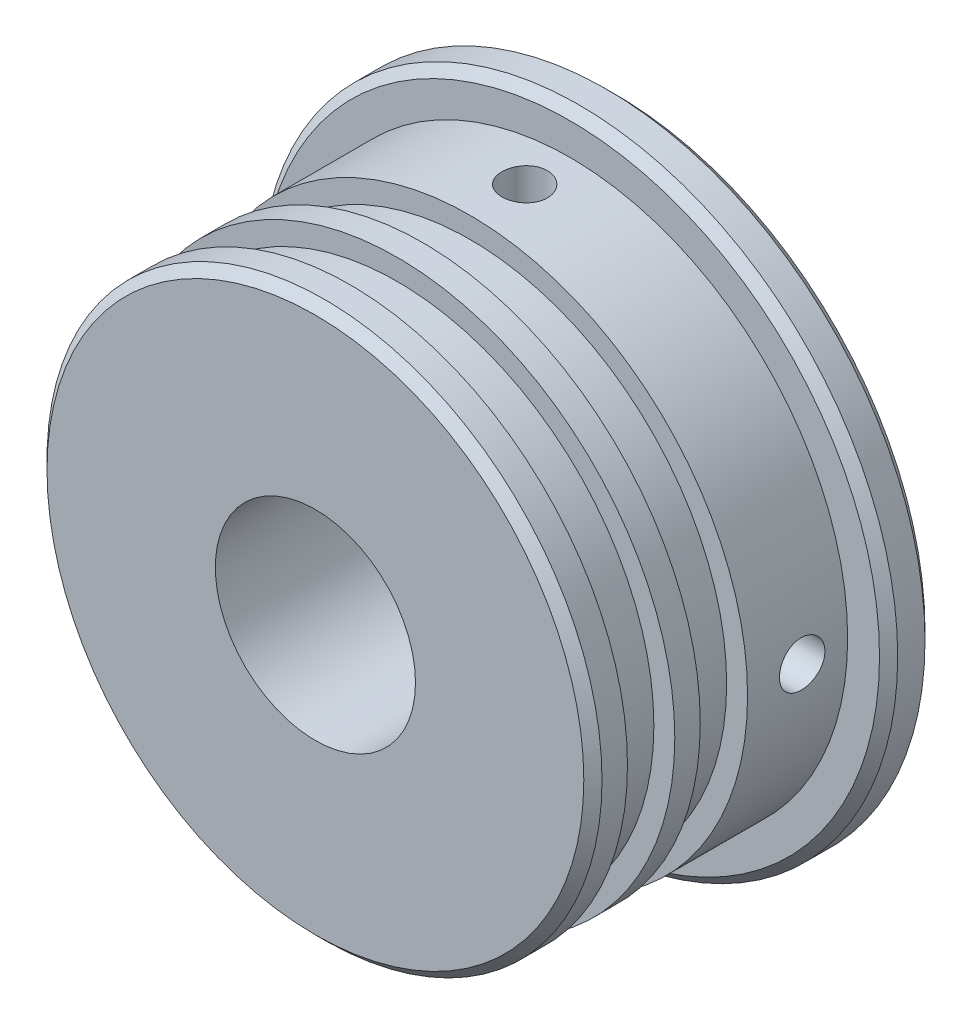
ISO-10303-21;
HEADER;
FILE_DESCRIPTION(('STEP AP214'),'2;1');
FILE_NAME('part.step','',(''),(''),'','','');
FILE_SCHEMA(('AUTOMOTIVE_DESIGN { 1 0 10303 214 1 1 1 1 }'));
ENDSEC;
DATA;
#1=APPLICATION_CONTEXT('core data for automotive mechanical design processes');
#2=APPLICATION_PROTOCOL_DEFINITION('international standard','automotive_design',2000,#1);
#3=PRODUCT_CONTEXT('',#1,'mechanical');
#4=PRODUCT('Part','Part','',(#3));
#5=PRODUCT_RELATED_PRODUCT_CATEGORY('part','',(#4));
#6=PRODUCT_DEFINITION_FORMATION('','',#4);
#7=PRODUCT_DEFINITION_CONTEXT('part definition',#1,'design');
#8=PRODUCT_DEFINITION('design','',#6,#7);
#9=PRODUCT_DEFINITION_SHAPE('','',#8);
#10=(LENGTH_UNIT() NAMED_UNIT(*) SI_UNIT(.MILLI.,.METRE.));
#11=(NAMED_UNIT(*) PLANE_ANGLE_UNIT() SI_UNIT($,.RADIAN.));
#12=(NAMED_UNIT(*) SI_UNIT($,.STERADIAN.) SOLID_ANGLE_UNIT());
#13=UNCERTAINTY_MEASURE_WITH_UNIT(LENGTH_MEASURE(1.E-05),#10,'distance_accuracy_value','');
#14=(GEOMETRIC_REPRESENTATION_CONTEXT(3) GLOBAL_UNCERTAINTY_ASSIGNED_CONTEXT((#13)) GLOBAL_UNIT_ASSIGNED_CONTEXT((#10,
#11,#12)) REPRESENTATION_CONTEXT('',''));
#15=CARTESIAN_POINT('',(0.,0.,0.));
#16=DIRECTION('',(0.,0.,1.));
#17=DIRECTION('',(1.,0.,0.));
#18=AXIS2_PLACEMENT_3D('',#15,#16,#17);
#19=CARTESIAN_POINT('',(0.,0.,14.));
#20=DIRECTION('',(0.,0.,-1.));
#21=DIRECTION('',(-1.,0.,0.));
#22=AXIS2_PLACEMENT_3D('',#19,#20,#21);
#23=CYLINDRICAL_SURFACE('',#22,15.25);
#24=CARTESIAN_POINT('',(0.,0.,0.));
#25=DIRECTION('',(0.,0.,1.));
#26=DIRECTION('',(1.,0.,0.));
#27=AXIS2_PLACEMENT_3D('',#24,#25,#26);
#28=CIRCLE('',#27,15.25);
#29=CARTESIAN_POINT('',(15.25,0.,0.));
#30=VERTEX_POINT('',#29);
#31=EDGE_CURVE('E191',#30,#30,#28,.T.);
#32=ORIENTED_EDGE('',*,*,#31,.T.);
#33=EDGE_LOOP('',(#32));
#34=FACE_BOUND('',#33,.T.);
#35=CARTESIAN_POINT('',(0.,0.,5.5));
#36=DIRECTION('',(0.,0.,1.));
#37=DIRECTION('',(1.,0.,0.));
#38=AXIS2_PLACEMENT_3D('',#35,#36,#37);
#39=CIRCLE('',#38,15.25);
#40=CARTESIAN_POINT('',(15.25,0.,5.5));
#41=VERTEX_POINT('',#40);
#42=EDGE_CURVE('E181',#41,#41,#39,.T.);
#43=ORIENTED_EDGE('',*,*,#42,.F.);
#44=EDGE_LOOP('',(#43));
#45=FACE_BOUND('',#44,.T.);
#46=CARTESIAN_POINT('',(0.,15.25,1.25));
#47=CARTESIAN_POINT('',(-0.0700868429087924,15.2499993280766,1.25000306301438));
#48=CARTESIAN_POINT('',(-0.140221499274186,15.2495116842103,1.25591442481886));
#49=CARTESIAN_POINT('',(-0.278550618483761,15.2476132613451,1.2794091397311));
#50=CARTESIAN_POINT('',(-0.346742787000886,15.2462014343999,1.29700574325258));
#51=CARTESIAN_POINT('',(-0.479163454668353,15.2426142015101,1.34335892818687));
#52=CARTESIAN_POINT('',(-0.543394161743101,15.2404392255128,1.37210922672617));
#53=CARTESIAN_POINT('',(-0.666102613849485,15.2355696593066,1.43994252213517));
#54=CARTESIAN_POINT('',(-0.72458159220008,15.2328751808608,1.47902329722773));
#55=CARTESIAN_POINT('',(-0.83428654311789,15.2272615583992,1.56651254117023));
#56=CARTESIAN_POINT('',(-0.885496350167448,15.2243419352614,1.61494125140961));
#57=CARTESIAN_POINT('',(-0.979070625550507,15.2186111080804,1.71970893756529));
#58=CARTESIAN_POINT('',(-1.02143470675745,15.2157999087865,1.77604825950319));
#59=CARTESIAN_POINT('',(-1.09616942084751,15.210599036483,1.89513543715002));
#60=CARTESIAN_POINT('',(-1.12852588903954,15.2082099629771,1.95789221052103));
#61=CARTESIAN_POINT('',(-1.18223640576973,15.2041292700176,2.08797068355829));
#62=CARTESIAN_POINT('',(-1.20359064296279,15.2024376386051,2.15529230492883));
#63=CARTESIAN_POINT('',(-1.23464375102437,15.1999473505619,2.29242781546401));
#64=CARTESIAN_POINT('',(-1.24436890544832,15.1991466805041,2.36223571579096));
#65=CARTESIAN_POINT('',(-1.25196897978082,15.198522591526,2.50249727871425));
#66=CARTESIAN_POINT('',(-1.2498441155197,15.1986991548068,2.57295092952587));
#67=CARTESIAN_POINT('',(-1.23382619797773,15.2000077548943,2.71232402919903));
#68=CARTESIAN_POINT('',(-1.21996170045579,15.2011374732007,2.781246784736));
#69=CARTESIAN_POINT('',(-1.18090243753149,15.2042214524571,2.91578362416247));
#70=CARTESIAN_POINT('',(-1.15570756462738,15.2061757212304,2.98139767665268));
#71=CARTESIAN_POINT('',(-1.09467073544124,15.2106912689216,3.10754562486508));
#72=CARTESIAN_POINT('',(-1.05881595691954,15.213253278104,3.16807328933147));
#73=CARTESIAN_POINT('',(-0.977486348890948,15.218694949435,3.28226216130019));
#74=CARTESIAN_POINT('',(-0.932011330983623,15.2215746178039,3.33592323429583));
#75=CARTESIAN_POINT('',(-0.83257190200739,15.2273374481536,3.43502172701963));
#76=CARTESIAN_POINT('',(-0.778582802157169,15.2302205953131,3.4804343775802));
#77=CARTESIAN_POINT('',(-0.663733925208983,15.2356574071383,3.56155545049435));
#78=CARTESIAN_POINT('',(-0.602874143714134,15.2382110715931,3.59726386663766));
#79=CARTESIAN_POINT('',(-0.475995469446632,15.2427016502544,3.65796125689699));
#80=CARTESIAN_POINT('',(-0.40997605517001,15.2446385020167,3.68294914578724));
#81=CARTESIAN_POINT('',(-0.274659503256255,15.247676499519,3.72147888435788));
#82=CARTESIAN_POINT('',(-0.205362431459666,15.2487776620386,3.73502096385503));
#83=CARTESIAN_POINT('',(-0.0656723647526651,15.2500180549452,3.75024364586132));
#84=CARTESIAN_POINT('',(0.00471687800008904,15.2501600600542,3.75195846345862));
#85=CARTESIAN_POINT('',(0.14478186253043,15.2494735463779,3.7435675585618));
#86=CARTESIAN_POINT('',(0.214457610738095,15.2486450363468,3.73346194268926));
#87=CARTESIAN_POINT('',(0.351020295392792,15.2461124596337,3.70174538863647));
#88=CARTESIAN_POINT('',(0.41791093659395,15.2444095990401,3.68015029767846));
#89=CARTESIAN_POINT('',(0.547119356040493,15.2403196360293,3.62608397799776));
#90=CARTESIAN_POINT('',(0.609437064248042,15.2379325231352,3.59361258273883));
#91=CARTESIAN_POINT('',(0.727886425550712,15.2327347804462,3.51862933263179));
#92=CARTESIAN_POINT('',(0.784003678514773,15.2299231992295,3.47609479718825));
#93=CARTESIAN_POINT('',(0.888313835484227,15.2241956377279,3.38222544765046));
#94=CARTESIAN_POINT('',(0.936506606260644,15.2212796556887,3.3308904856302));
#95=CARTESIAN_POINT('',(1.02371703784269,15.2156637405143,3.22072908525297));
#96=CARTESIAN_POINT('',(1.06271238083786,15.2129643431806,3.16188494767183));
#97=CARTESIAN_POINT('',(1.13026802407668,15.2080947598364,3.03846372819848));
#98=CARTESIAN_POINT('',(1.15882842559743,15.2059245686898,2.97388670195479));
#99=CARTESIAN_POINT('',(1.20466539747239,15.2023620805104,2.8409120191016));
#100=CARTESIAN_POINT('',(1.22195565828569,15.2009688399715,2.77251910796312));
#101=CARTESIAN_POINT('',(1.24480612564966,15.1991148163268,2.633789027968));
#102=CARTESIAN_POINT('',(1.25036654931429,15.198654015962,2.56345189512241));
#103=CARTESIAN_POINT('',(1.24959702875324,15.1987172866662,2.42305178436102));
#104=CARTESIAN_POINT('',(1.24330215197592,15.1992384531232,2.35298861026405));
#105=CARTESIAN_POINT('',(1.21907381047037,15.201200764538,2.21491809012702));
#106=CARTESIAN_POINT('',(1.20114032769815,15.2026419109221,2.14691074727439));
#107=CARTESIAN_POINT('',(1.15415265709678,15.2062810387023,2.01487987806237));
#108=CARTESIAN_POINT('',(1.12509906889614,15.2084789792893,1.95085613711191));
#109=CARTESIAN_POINT('',(1.05669988676471,15.2133841018093,1.82858935076014));
#110=CARTESIAN_POINT('',(1.01735446212428,15.2160912753659,1.77034621029551));
#111=CARTESIAN_POINT('',(0.929356780527805,15.2217193443612,1.66111454001474));
#112=CARTESIAN_POINT('',(0.880678585944513,15.2246408210819,1.61014693575611));
#113=CARTESIAN_POINT('',(0.775443669354106,15.2303630218454,1.5170853062341));
#114=CARTESIAN_POINT('',(0.718885042337266,15.2331637164755,1.47499343278552));
#115=CARTESIAN_POINT('',(0.599389140420523,15.2383336734095,1.40082361781703));
#116=CARTESIAN_POINT('',(0.536440480834047,15.2407021438841,1.3687639799632));
#117=CARTESIAN_POINT('',(0.406077398152225,15.244731428387,1.31571014744989));
#118=CARTESIAN_POINT('',(0.338668216820175,15.2463930565732,1.29470321537387));
#119=CARTESIAN_POINT('',(0.225716881578611,15.2483942112371,1.26970931549527));
#120=CARTESIAN_POINT('',(0.180901423889862,15.2489936455353,1.26232812603322));
#121=CARTESIAN_POINT('',(0.0907306568461201,15.2497967569183,1.25247248302948));
#122=CARTESIAN_POINT('',(0.0453753488702889,15.250000435014,1.24999801695524));
#123=CARTESIAN_POINT('',(0.,15.25,1.25));
#124=B_SPLINE_CURVE_WITH_KNOTS('',3,(#46,#47,#48,#49,#50,#51,#52,#53,#54,#55,#56,#57,#58,#59,
#60,#61,#62,#63,#64,#65,#66,#67,#68,#69,#70,#71,#72,#73,#74,#75,#76,#77,#78,#79,#80,#81,#82,#83,
#84,#85,#86,#87,#88,#89,#90,#91,#92,#93,#94,#95,#96,#97,#98,#99,#100,#101,#102,#103,#104,#105,
#106,#107,#108,#109,#110,#111,#112,#113,#114,#115,#116,#117,#118,#119,#120,#121,#122,#123),
.UNSPECIFIED.,.T.,.F.,(4,2,2,2,2,2,2,2,2,2,2,2,2,2,2,2,2,2,2,2,2,2,2,2,2,2,2,2,2,2,2,2,2,2,2,2,
2,2,4),(0.,0.210094860791217,0.42042836520023,0.6306435604321,0.840813581383413,
1.05144390166047,1.2620834380843,1.47301976181957,1.68395246851599,1.89440752754976,
2.10485875347288,2.31479953859993,2.52474231567163,2.73493865064623,2.94513910243604,
3.15596068923547,3.36678241095067,3.57762546885637,3.788464293211,3.9986929251026,
4.20891966072406,4.41885718332474,4.6287979206024,4.83921641332595,5.04963844331211,
5.26056593258537,5.47149137463205,5.68216011407615,5.89282495410355,6.10286763547763,
6.31291064249356,6.52294232497331,6.73297055286048,6.9435911817377,7.15426281450869,
7.36531660326365,7.57612663261143,7.71214577055269,7.84816456107893),.UNSPECIFIED.);
#125=CARTESIAN_POINT('',(0.,15.25,1.25));
#126=VERTEX_POINT('',#125);
#127=EDGE_CURVE('E71',#126,#126,#124,.T.);
#128=ORIENTED_EDGE('',*,*,#127,.F.);
#129=EDGE_LOOP('',(#128));
#130=FACE_BOUND('',#129,.T.);
#131=CARTESIAN_POINT('',(15.1986841535707,-1.24999999999984,2.5));
#132=CARTESIAN_POINT('',(15.1986848339446,-1.24999693658352,2.42991360305348));
#133=CARTESIAN_POINT('',(15.199174161196,-1.24408564746329,2.35977939119693));
#134=CARTESIAN_POINT('',(15.2010785982593,-1.22059124751342,2.22145119558452));
#135=CARTESIAN_POINT('',(15.2024947591589,-1.2029948847416,2.15325950650436));
#136=CARTESIAN_POINT('',(15.2060913945655,-1.15664240411943,2.02083985247226));
#137=CARTESIAN_POINT('',(15.2082714379165,-1.12789258060607,1.95660967553571));
#138=CARTESIAN_POINT('',(15.2131496620471,-1.06006040374254,1.83390211116577));
#139=CARTESIAN_POINT('',(15.2158477314376,-1.02098027099786,1.77542349107885));
#140=CARTESIAN_POINT('',(15.2214655434985,-0.933491674996942,1.6657181334001));
#141=CARTESIAN_POINT('',(15.2243857619743,-0.885062826932664,1.61450767533015));
#142=CARTESIAN_POINT('',(15.2301144747859,-0.780294592080531,1.52093214410294));
#143=CARTESIAN_POINT('',(15.2329229642528,-0.723954861044009,1.47856745607637));
#144=CARTESIAN_POINT('',(15.2381162629198,-0.604867327155328,1.40383210916556));
#145=CARTESIAN_POINT('',(15.2405004743981,-0.542110676973627,1.3714755030423));
#146=CARTESIAN_POINT('',(15.2445714601224,-0.412032471746592,1.31776469729084));
#147=CARTESIAN_POINT('',(15.2462582462226,-0.344710994311932,1.2964103106572));
#148=CARTESIAN_POINT('',(15.2487410029099,-0.207575915492183,1.26535688775954));
#149=CARTESIAN_POINT('',(15.2495389829939,-0.137768305578273,1.25563155574531));
#150=CARTESIAN_POINT('',(15.250161023854,0.00249268938558378,1.24803102562128));
#151=CARTESIAN_POINT('',(15.249985102212,0.0729460627545569,1.2501556135834));
#152=CARTESIAN_POINT('',(15.2486808206319,0.212320386098874,1.26617309559805));
#153=CARTESIAN_POINT('',(15.2475547493001,0.281244610259826,1.28003771196652));
#154=CARTESIAN_POINT('',(15.2444794672483,0.415784325641072,1.31909772239888));
#155=CARTESIAN_POINT('',(15.2425302489126,0.481399786242991,1.34429322129421));
#156=CARTESIAN_POINT('',(15.2380240375926,0.607549433922569,1.40533134267823));
#157=CARTESIAN_POINT('',(15.2354663217737,0.668077461017877,1.44118664069611));
#158=CARTESIAN_POINT('',(15.2300305791155,0.782266837544206,1.52251735536991));
#159=CARTESIAN_POINT('',(15.2271525459942,0.835928052258726,1.56799296071533));
#160=CARTESIAN_POINT('',(15.2213896563097,0.935025874267423,1.66743280398354));
#161=CARTESIAN_POINT('',(15.2185048045695,0.980437831210621,1.72142161136147));
#162=CARTESIAN_POINT('',(15.2130619392315,1.06155764436563,1.83626965687285));
#163=CARTESIAN_POINT('',(15.2105039258905,1.09726549295039,1.89712890040615));
#164=CARTESIAN_POINT('',(15.2060038751374,1.15796247582315,2.02400743401802));
#165=CARTESIAN_POINT('',(15.2040619102206,1.18295034872664,2.09002733025384));
#166=CARTESIAN_POINT('',(15.2010152176372,1.22147990740891,2.2253449290061));
#167=CARTESIAN_POINT('',(15.1999104729489,1.23502182589802,2.29464256485182));
#168=CARTESIAN_POINT('',(15.1986660440273,1.25024390136809,2.43433288586504));
#169=CARTESIAN_POINT('',(15.1985235637509,1.25195842541547,2.50472180219505));
#170=CARTESIAN_POINT('',(15.1992124146146,1.24356704994933,2.64478606317713));
#171=CARTESIAN_POINT('',(15.2000437369714,1.23346125705034,2.71446141425955));
#172=CARTESIAN_POINT('',(15.2025839730989,1.20174475707424,2.85102216448946));
#173=CARTESIAN_POINT('',(15.2042916645498,1.18015007264501,2.91791130959227));
#174=CARTESIAN_POINT('',(15.2083912076355,1.12608506759044,3.04711691691239));
#175=CARTESIAN_POINT('',(15.2107830698969,1.09361457804043,3.10943330808664));
#176=CARTESIAN_POINT('',(15.2159882279838,1.01863265402226,3.22788178439302));
#177=CARTESIAN_POINT('',(15.2188024799744,0.97609830870094,3.28399932352413));
#178=CARTESIAN_POINT('',(15.2245320773169,0.882229174899993,3.38831014655002));
#179=CARTESIAN_POINT('',(15.2274474243518,0.830894239866416,3.43650329845584));
#180=CARTESIAN_POINT('',(15.2330590376291,0.72073267055032,3.52371453600203));
#181=CARTESIAN_POINT('',(15.23575476067,0.66188833275854,3.56271029906659));
#182=CARTESIAN_POINT('',(15.2406155617798,0.538466602526535,3.63026667968633));
#183=CARTESIAN_POINT('',(15.2427806450028,0.473889265780309,3.65882739860038));
#184=CARTESIAN_POINT('',(15.2463337134228,0.340914793228101,3.70466458427029));
#185=CARTESIAN_POINT('',(15.2477226505895,0.272522450456076,3.72195487894049));
#186=CARTESIAN_POINT('',(15.2495707915124,0.133793567732087,3.74480560667045));
#187=CARTESIAN_POINT('',(15.2500300122377,0.0634570632886172,3.75036625381922));
#188=CARTESIAN_POINT('',(15.2499670067415,-0.0769434451044363,3.7495973777545));
#189=CARTESIAN_POINT('',(15.2494476529438,-0.147007643544878,3.74330265380566));
#190=CARTESIAN_POINT('',(15.2474915385945,-0.285080250094358,3.71907425726429));
#191=CARTESIAN_POINT('',(15.2460547767643,-0.353088655337742,3.70114056844852));
#192=CARTESIAN_POINT('',(15.2424250725383,-0.485121627507812,3.6541520931392));
#193=CARTESIAN_POINT('',(15.2402321705169,-0.549146406926175,3.62509790041974));
#194=CARTESIAN_POINT('',(15.2353355815636,-0.671415017419427,3.55669718835404));
#195=CARTESIAN_POINT('',(15.2326319030899,-0.729658944199258,3.51735083943888));
#196=CARTESIAN_POINT('',(15.2270078279113,-0.838890548849217,3.42935214954373));
#197=CARTESIAN_POINT('',(15.2240868460688,-0.889857470519754,3.3806740817463));
#198=CARTESIAN_POINT('',(15.2183623467353,-0.982917782161334,3.27543969842741));
#199=CARTESIAN_POINT('',(15.2155588578845,-1.02500901854132,3.21888147638586));
#200=CARTESIAN_POINT('',(15.2103812075108,-1.09917815738628,3.09938589608275));
#201=CARTESIAN_POINT('',(15.2080078391107,-1.13123763923894,3.03643708057574));
#202=CARTESIAN_POINT('',(15.2039688561467,-1.1842911367374,2.90607366549575));
#203=CARTESIAN_POINT('',(15.202302427177,-1.20529789204799,2.83866430864196));
#204=CARTESIAN_POINT('',(15.2002951847963,-1.23029128755323,2.72571344742056));
#205=CARTESIAN_POINT('',(15.1996938195012,-1.23767225011609,2.68089867495409));
#206=CARTESIAN_POINT('',(15.1988880841608,-1.2475275916435,2.59072928111191));
#207=CARTESIAN_POINT('',(15.1986837130896,-1.25000198328738,2.54537466113155));
#208=CARTESIAN_POINT('',(15.1986841535707,-1.24999999999984,2.5));
#209=B_SPLINE_CURVE_WITH_KNOTS('',3,(#131,#132,#133,#134,#135,#136,#137,#138,#139,#140,#141,
#142,#143,#144,#145,#146,#147,#148,#149,#150,#151,#152,#153,#154,#155,#156,#157,#158,#159,#160,
#161,#162,#163,#164,#165,#166,#167,#168,#169,#170,#171,#172,#173,#174,#175,#176,#177,#178,#179,
#180,#181,#182,#183,#184,#185,#186,#187,#188,#189,#190,#191,#192,#193,#194,#195,#196,#197,#198,
#199,#200,#201,#202,#203,#204,#205,#206,#207,#208),.UNSPECIFIED.,.T.,.F.,(4,2,2,2,2,2,2,2,2,2,2,
2,2,2,2,2,2,2,2,2,2,2,2,2,2,2,2,2,2,2,2,2,2,2,2,2,2,2,4),(0.,0.210093521323371,
0.420425715756466,0.630639383716231,0.840807900796242,1.05143997368959,1.26208121525537,
1.47301689808563,1.68394899551014,1.89440322343688,2.10485365201923,2.31479861521414,
2.52474552082472,2.7349430789113,2.94514476012483,3.1559645863687,3.36678457830843,
3.57762936994871,3.78846987475219,3.99869747759378,4.20892318428145,4.41885647140858,
4.62879301940303,4.8392121762978,5.04963483758905,5.26056306858212,5.4714892507083,
5.68215615362665,5.89281921142862,6.10286487007458,6.31291082149818,6.52294555918085,
6.73297681905195,6.94359566979172,7.15426556631035,7.36532006153524,7.57613075388127,
7.71214783260012,7.84816455982974),.UNSPECIFIED.);
#210=CARTESIAN_POINT('',(15.1986841535707,-1.24999999999984,2.5));
#211=VERTEX_POINT('',#210);
#212=EDGE_CURVE('E80',#211,#211,#209,.T.);
#213=ORIENTED_EDGE('',*,*,#212,.F.);
#214=EDGE_LOOP('',(#213));
#215=FACE_BOUND('',#214,.T.);
#216=CARTESIAN_POINT('',(0.,-15.25,3.75));
#217=CARTESIAN_POINT('',(-0.0700868429087924,-15.2499993280766,3.74999693698562));
#218=CARTESIAN_POINT('',(-0.140221499274186,-15.2495116842103,3.74408557518114));
#219=CARTESIAN_POINT('',(-0.278550618483761,-15.2476132613451,3.7205908602689));
#220=CARTESIAN_POINT('',(-0.346742787000885,-15.2462014343999,3.70299425674742));
#221=CARTESIAN_POINT('',(-0.479163454668353,-15.2426142015101,3.65664107181313));
#222=CARTESIAN_POINT('',(-0.543394161743102,-15.2404392255128,3.62789077327383));
#223=CARTESIAN_POINT('',(-0.666102613849485,-15.2355696593066,3.56005747786483));
#224=CARTESIAN_POINT('',(-0.724581592200081,-15.2328751808608,3.52097670277227));
#225=CARTESIAN_POINT('',(-0.83428654311789,-15.2272615583992,3.43348745882977));
#226=CARTESIAN_POINT('',(-0.885496350167448,-15.2243419352614,3.38505874859039));
#227=CARTESIAN_POINT('',(-0.979070625550507,-15.2186111080804,3.28029106243471));
#228=CARTESIAN_POINT('',(-1.02143470675745,-15.2157999087865,3.22395174049681));
#229=CARTESIAN_POINT('',(-1.09616942084751,-15.210599036483,3.10486456284998));
#230=CARTESIAN_POINT('',(-1.12852588903954,-15.2082099629771,3.04210778947897));
#231=CARTESIAN_POINT('',(-1.18223640576973,-15.2041292700176,2.91202931644171));
#232=CARTESIAN_POINT('',(-1.20359064296279,-15.2024376386051,2.84470769507117));
#233=CARTESIAN_POINT('',(-1.23464375102437,-15.1999473505619,2.70757218453599));
#234=CARTESIAN_POINT('',(-1.24436890544832,-15.1991466805041,2.63776428420904));
#235=CARTESIAN_POINT('',(-1.25196897978082,-15.198522591526,2.49750272128575));
#236=CARTESIAN_POINT('',(-1.2498441155197,-15.1986991548068,2.42704907047413));
#237=CARTESIAN_POINT('',(-1.23382619797773,-15.2000077548943,2.28767597080097));
#238=CARTESIAN_POINT('',(-1.21996170045579,-15.2011374732007,2.218753215264));
#239=CARTESIAN_POINT('',(-1.18090243753149,-15.2042214524571,2.08421637583753));
#240=CARTESIAN_POINT('',(-1.15570756462738,-15.2061757212304,2.01860232334732));
#241=CARTESIAN_POINT('',(-1.09467073544124,-15.2106912689216,1.89245437513492));
#242=CARTESIAN_POINT('',(-1.05881595691954,-15.213253278104,1.83192671066853));
#243=CARTESIAN_POINT('',(-0.977486348890948,-15.218694949435,1.71773783869981));
#244=CARTESIAN_POINT('',(-0.932011330983623,-15.2215746178039,1.66407676570417));
#245=CARTESIAN_POINT('',(-0.83257190200739,-15.2273374481536,1.56497827298037));
#246=CARTESIAN_POINT('',(-0.77858280215717,-15.2302205953131,1.5195656224198));
#247=CARTESIAN_POINT('',(-0.663733925208984,-15.2356574071383,1.43844454950565));
#248=CARTESIAN_POINT('',(-0.602874143714134,-15.2382110715931,1.40273613336234));
#249=CARTESIAN_POINT('',(-0.475995469446633,-15.2427016502544,1.34203874310301));
#250=CARTESIAN_POINT('',(-0.40997605517001,-15.2446385020167,1.31705085421276));
#251=CARTESIAN_POINT('',(-0.274659503256256,-15.247676499519,1.27852111564212));
#252=CARTESIAN_POINT('',(-0.205362431459666,-15.2487776620386,1.26497903614497));
#253=CARTESIAN_POINT('',(-0.0656723647526657,-15.2500180549452,1.24975635413868));
#254=CARTESIAN_POINT('',(0.00471687800008803,-15.2501600600542,1.24804153654138));
#255=CARTESIAN_POINT('',(0.144781862530429,-15.2494735463779,1.2564324414382));
#256=CARTESIAN_POINT('',(0.214457610738094,-15.2486450363468,1.26653805731074));
#257=CARTESIAN_POINT('',(0.351020295392792,-15.2461124596337,1.29825461136353));
#258=CARTESIAN_POINT('',(0.417910936593949,-15.2444095990401,1.31984970232154));
#259=CARTESIAN_POINT('',(0.547119356040493,-15.2403196360293,1.37391602200224));
#260=CARTESIAN_POINT('',(0.609437064248042,-15.2379325231352,1.40638741726117));
#261=CARTESIAN_POINT('',(0.727886425550711,-15.2327347804462,1.48137066736821));
#262=CARTESIAN_POINT('',(0.784003678514773,-15.2299231992295,1.52390520281175));
#263=CARTESIAN_POINT('',(0.888313835484227,-15.2241956377279,1.61777455234954));
#264=CARTESIAN_POINT('',(0.936506606260644,-15.2212796556887,1.6691095143698));
#265=CARTESIAN_POINT('',(1.02371703784269,-15.2156637405143,1.77927091474702));
#266=CARTESIAN_POINT('',(1.06271238083786,-15.2129643431806,1.83811505232816));
#267=CARTESIAN_POINT('',(1.13026802407668,-15.2080947598364,1.96153627180152));
#268=CARTESIAN_POINT('',(1.15882842559743,-15.2059245686898,2.02611329804521));
#269=CARTESIAN_POINT('',(1.20466539747239,-15.2023620805104,2.1590879808984));
#270=CARTESIAN_POINT('',(1.22195565828569,-15.2009688399715,2.22748089203688));
#271=CARTESIAN_POINT('',(1.24480612564966,-15.1991148163268,2.366210972032));
#272=CARTESIAN_POINT('',(1.25036654931429,-15.198654015962,2.43654810487759));
#273=CARTESIAN_POINT('',(1.24959702875324,-15.1987172866662,2.57694821563898));
#274=CARTESIAN_POINT('',(1.24330215197592,-15.1992384531232,2.64701138973595));
#275=CARTESIAN_POINT('',(1.21907381047037,-15.201200764538,2.78508190987298));
#276=CARTESIAN_POINT('',(1.20114032769815,-15.2026419109221,2.8530892527256));
#277=CARTESIAN_POINT('',(1.15415265709678,-15.2062810387023,2.98512012193763));
#278=CARTESIAN_POINT('',(1.12509906889614,-15.2084789792893,3.04914386288809));
#279=CARTESIAN_POINT('',(1.05669988676471,-15.2133841018093,3.17141064923986));
#280=CARTESIAN_POINT('',(1.01735446212428,-15.2160912753659,3.22965378970449));
#281=CARTESIAN_POINT('',(0.929356780527805,-15.2217193443612,3.33888545998526));
#282=CARTESIAN_POINT('',(0.880678585944513,-15.2246408210819,3.38985306424389));
#283=CARTESIAN_POINT('',(0.775443669354107,-15.2303630218454,3.4829146937659));
#284=CARTESIAN_POINT('',(0.718885042337267,-15.2331637164755,3.52500656721448));
#285=CARTESIAN_POINT('',(0.599389140420524,-15.2383336734095,3.59917638218297));
#286=CARTESIAN_POINT('',(0.536440480834047,-15.2407021438841,3.6312360200368));
#287=CARTESIAN_POINT('',(0.406077398152225,-15.244731428387,3.68428985255011));
#288=CARTESIAN_POINT('',(0.338668216820175,-15.2463930565732,3.70529678462613));
#289=CARTESIAN_POINT('',(0.225716881578611,-15.2483942112371,3.73029068450473));
#290=CARTESIAN_POINT('',(0.180901423889862,-15.2489936455353,3.73767187396678));
#291=CARTESIAN_POINT('',(0.0907306568461201,-15.2497967569183,3.74752751697052));
#292=CARTESIAN_POINT('',(0.0453753488702889,-15.250000435014,3.75000198304476));
#293=CARTESIAN_POINT('',(0.,-15.25,3.75));
#294=B_SPLINE_CURVE_WITH_KNOTS('',3,(#216,#217,#218,#219,#220,#221,#222,#223,#224,#225,#226,
#227,#228,#229,#230,#231,#232,#233,#234,#235,#236,#237,#238,#239,#240,#241,#242,#243,#244,#245,
#246,#247,#248,#249,#250,#251,#252,#253,#254,#255,#256,#257,#258,#259,#260,#261,#262,#263,#264,
#265,#266,#267,#268,#269,#270,#271,#272,#273,#274,#275,#276,#277,#278,#279,#280,#281,#282,#283,
#284,#285,#286,#287,#288,#289,#290,#291,#292,#293),.UNSPECIFIED.,.T.,.F.,(4,2,2,2,2,2,2,2,2,2,2,
2,2,2,2,2,2,2,2,2,2,2,2,2,2,2,2,2,2,2,2,2,2,2,2,2,2,2,4),(0.,0.210094860791217,0.42042836520023,
0.630643560432101,0.840813581383413,1.05144390166047,1.2620834380843,1.47301976181957,
1.68395246851599,1.89440752754976,2.10485875347288,2.31479953859994,2.52474231567163,
2.73493865064623,2.94513910243604,3.15596068923547,3.36678241095067,3.57762546885637,
3.788464293211,3.9986929251026,4.20891966072406,4.41885718332474,4.6287979206024,
4.83921641332595,5.04963844331211,5.26056593258537,5.47149137463205,5.68216011407615,
5.89282495410355,6.10286763547763,6.31291064249356,6.52294232497331,6.73297055286048,
6.9435911817377,7.15426281450869,7.36531660326365,7.57612663261144,7.71214577055269,
7.84816456107893),.UNSPECIFIED.);
#295=CARTESIAN_POINT('',(0.,-15.25,3.75));
#296=VERTEX_POINT('',#295);
#297=EDGE_CURVE('E250',#296,#296,#294,.T.);
#298=ORIENTED_EDGE('',*,*,#297,.F.);
#299=EDGE_LOOP('',(#298));
#300=FACE_BOUND('',#299,.T.);
#301=CARTESIAN_POINT('',(-15.25,0.,3.75));
#302=CARTESIAN_POINT('',(-15.2499993280766,0.0700868429087924,3.74999693698561));
#303=CARTESIAN_POINT('',(-15.2495116842103,0.140221499274186,3.74408557518113));
#304=CARTESIAN_POINT('',(-15.2476132613451,0.278550618483759,3.72059086026889));
#305=CARTESIAN_POINT('',(-15.2462014343999,0.346742787000883,3.7029942567474));
#306=CARTESIAN_POINT('',(-15.2426142015101,0.479163454668349,3.65664107181311));
#307=CARTESIAN_POINT('',(-15.2404392255128,0.543394161743096,3.62789077327381));
#308=CARTESIAN_POINT('',(-15.2355696593066,0.666102613849477,3.56005747786481));
#309=CARTESIAN_POINT('',(-15.2328751808608,0.724581592200071,3.52097670277224));
#310=CARTESIAN_POINT('',(-15.2272615583992,0.834286543117876,3.43348745882974));
#311=CARTESIAN_POINT('',(-15.2243419352614,0.885496350167433,3.38505874859035));
#312=CARTESIAN_POINT('',(-15.2186111080804,0.979070625550488,3.28029106243467));
#313=CARTESIAN_POINT('',(-15.2157999087865,1.02143470675743,3.22395174049677));
#314=CARTESIAN_POINT('',(-15.210599036483,1.09616942084748,3.10486456284994));
#315=CARTESIAN_POINT('',(-15.2082099629771,1.12852588903951,3.04210778947892));
#316=CARTESIAN_POINT('',(-15.2041292700176,1.18223640576969,2.91202931644166));
#317=CARTESIAN_POINT('',(-15.2024376386051,1.20359064296275,2.84470769507112));
#318=CARTESIAN_POINT('',(-15.1999473505619,1.23464375102432,2.70757218453594));
#319=CARTESIAN_POINT('',(-15.1991466805041,1.24436890544827,2.63776428420899));
#320=CARTESIAN_POINT('',(-15.198522591526,1.25196897978077,2.4975027212857));
#321=CARTESIAN_POINT('',(-15.1986991548068,1.24984411551964,2.42704907047408));
#322=CARTESIAN_POINT('',(-15.2000077548944,1.23382619797767,2.28767597080092));
#323=CARTESIAN_POINT('',(-15.2011374732007,1.21996170045572,2.21875321526395));
#324=CARTESIAN_POINT('',(-15.2042214524571,1.18090243753142,2.08421637583748));
#325=CARTESIAN_POINT('',(-15.2061757212304,1.15570756462731,2.01860232334728));
#326=CARTESIAN_POINT('',(-15.2106912689216,1.09467073544117,1.89245437513488));
#327=CARTESIAN_POINT('',(-15.213253278104,1.05881595691946,1.83192671066849));
#328=CARTESIAN_POINT('',(-15.218694949435,0.977486348890862,1.71773783869976));
#329=CARTESIAN_POINT('',(-15.2215746178039,0.932011330983534,1.66407676570413));
#330=CARTESIAN_POINT('',(-15.2273374481536,0.832571902007297,1.56497827298034));
#331=CARTESIAN_POINT('',(-15.2302205953131,0.778582802157075,1.51956562241977));
#332=CARTESIAN_POINT('',(-15.2356574071383,0.663733925208885,1.43844454950562));
#333=CARTESIAN_POINT('',(-15.2382110715931,0.602874143714034,1.40273613336231));
#334=CARTESIAN_POINT('',(-15.2427016502544,0.47599546944653,1.34203874310299));
#335=CARTESIAN_POINT('',(-15.2446385020167,0.409976055169906,1.31705085421275));
#336=CARTESIAN_POINT('',(-15.247676499519,0.27465950325615,1.27852111564211));
#337=CARTESIAN_POINT('',(-15.2487776620386,0.20536243145956,1.26497903614496));
#338=CARTESIAN_POINT('',(-15.2500180549452,0.0656723647525592,1.24975635413868));
#339=CARTESIAN_POINT('',(-15.2501600600542,-0.00471687800019477,1.24804153654138));
#340=CARTESIAN_POINT('',(-15.2494735463779,-0.144781862530535,1.2564324414382));
#341=CARTESIAN_POINT('',(-15.2486450363468,-0.2144576107382,1.26653805731075));
#342=CARTESIAN_POINT('',(-15.2461124596337,-0.351020295392896,1.29825461136355));
#343=CARTESIAN_POINT('',(-15.2444095990401,-0.417910936594053,1.31984970232156));
#344=CARTESIAN_POINT('',(-15.2403196360293,-0.547119356040594,1.37391602200226));
#345=CARTESIAN_POINT('',(-15.2379325231352,-0.609437064248142,1.4063874172612));
#346=CARTESIAN_POINT('',(-15.2327347804462,-0.727886425550808,1.48137066736824));
#347=CARTESIAN_POINT('',(-15.2299231992295,-0.784003678514868,1.52390520281178));
#348=CARTESIAN_POINT('',(-15.2241956377279,-0.888313835484318,1.61777455234958));
#349=CARTESIAN_POINT('',(-15.2212796556887,-0.936506606260733,1.66910951436984));
#350=CARTESIAN_POINT('',(-15.2156637405143,-1.02371703784278,1.77927091474707));
#351=CARTESIAN_POINT('',(-15.2129643431806,-1.06271238083794,1.83811505232821));
#352=CARTESIAN_POINT('',(-15.2080947598364,-1.13026802407676,1.96153627180157));
#353=CARTESIAN_POINT('',(-15.2059245686898,-1.1588284255975,2.02611329804526));
#354=CARTESIAN_POINT('',(-15.2023620805104,-1.20466539747246,2.15908798089846));
#355=CARTESIAN_POINT('',(-15.2009688399715,-1.22195565828575,2.22748089203693));
#356=CARTESIAN_POINT('',(-15.1991148163268,-1.24480612564972,2.36621097203206));
#357=CARTESIAN_POINT('',(-15.198654015962,-1.25036654931434,2.43654810487764));
#358=CARTESIAN_POINT('',(-15.1987172866662,-1.24959702875329,2.57694821563903));
#359=CARTESIAN_POINT('',(-15.1992384531232,-1.24330215197597,2.647011389736));
#360=CARTESIAN_POINT('',(-15.201200764538,-1.21907381047041,2.78508190987303));
#361=CARTESIAN_POINT('',(-15.2026419109221,-1.20114032769819,2.85308925272566));
#362=CARTESIAN_POINT('',(-15.2062810387023,-1.15415265709681,2.98512012193768));
#363=CARTESIAN_POINT('',(-15.2084789792893,-1.12509906889617,3.04914386288814));
#364=CARTESIAN_POINT('',(-15.2133841018093,-1.05669988676474,3.1714106492399));
#365=CARTESIAN_POINT('',(-15.2160912753659,-1.0173544621243,3.22965378970453));
#366=CARTESIAN_POINT('',(-15.2217193443612,-0.929356780527823,3.3388854599853));
#367=CARTESIAN_POINT('',(-15.2246408210819,-0.880678585944528,3.38985306424393));
#368=CARTESIAN_POINT('',(-15.2303630218454,-0.775443669354117,3.48291469376593));
#369=CARTESIAN_POINT('',(-15.2331637164755,-0.718885042337276,3.52500656721451));
#370=CARTESIAN_POINT('',(-15.2383336734095,-0.59938914042053,3.599176382183));
#371=CARTESIAN_POINT('',(-15.2407021438841,-0.536440480834052,3.63123602003683));
#372=CARTESIAN_POINT('',(-15.244731428387,-0.406077398152228,3.68428985255013));
#373=CARTESIAN_POINT('',(-15.2463930565732,-0.338668216820176,3.70529678462614));
#374=CARTESIAN_POINT('',(-15.2483942112371,-0.225716881578612,3.73029068450473));
#375=CARTESIAN_POINT('',(-15.2489936455353,-0.180901423889862,3.73767187396679));
#376=CARTESIAN_POINT('',(-15.2497967569183,-0.0907306568461199,3.74752751697052));
#377=CARTESIAN_POINT('',(-15.250000435014,-0.0453753488702887,3.75000198304476));
#378=CARTESIAN_POINT('',(-15.25,0.,3.75));
#379=B_SPLINE_CURVE_WITH_KNOTS('',3,(#301,#302,#303,#304,#305,#306,#307,#308,#309,#310,#311,
#312,#313,#314,#315,#316,#317,#318,#319,#320,#321,#322,#323,#324,#325,#326,#327,#328,#329,#330,
#331,#332,#333,#334,#335,#336,#337,#338,#339,#340,#341,#342,#343,#344,#345,#346,#347,#348,#349,
#350,#351,#352,#353,#354,#355,#356,#357,#358,#359,#360,#361,#362,#363,#364,#365,#366,#367,#368,
#369,#370,#371,#372,#373,#374,#375,#376,#377,#378),.UNSPECIFIED.,.T.,.F.,(4,2,2,2,2,2,2,2,2,2,2,
2,2,2,2,2,2,2,2,2,2,2,2,2,2,2,2,2,2,2,2,2,2,2,2,2,2,2,4),(0.,0.210094860791217,0.42042836520023,
0.6306435604321,0.840813581383413,1.05144390166047,1.2620834380843,1.47301976181957,
1.68395246851599,1.89440752754976,2.10485875347288,2.31479953859993,2.52474231567163,
2.73493865064623,2.94513910243604,3.15596068923547,3.36678241095067,3.57762546885637,
3.788464293211,3.9986929251026,4.20891966072406,4.41885718332474,4.62879792060239,
4.83921641332595,5.04963844331211,5.26056593258537,5.47149137463205,5.68216011407615,
5.89282495410355,6.10286763547763,6.31291064249356,6.52294232497331,6.73297055286048,
6.9435911817377,7.15426281450869,7.36531660326365,7.57612663261144,7.71214577055269,
7.84816456107893),.UNSPECIFIED.);
#380=CARTESIAN_POINT('',(-15.25,0.,3.75));
#381=VERTEX_POINT('',#380);
#382=EDGE_CURVE('E48',#381,#381,#379,.T.);
#383=ORIENTED_EDGE('',*,*,#382,.F.);
#384=EDGE_LOOP('',(#383));
#385=FACE_BOUND('',#384,.T.);
#386=ADVANCED_FACE('F43',(#34,#45,#130,#215,#300,#385),#23,.T.);
#387=CARTESIAN_POINT('',(0.,0.,-2.5));
#388=DIRECTION('',(0.,0.,1.));
#389=DIRECTION('',(1.,0.,0.));
#390=AXIS2_PLACEMENT_3D('',#387,#388,#389);
#391=CYLINDRICAL_SURFACE('',#390,5.5);
#392=CARTESIAN_POINT('',(0.,0.,14.));
#393=DIRECTION('',(0.,0.,1.));
#394=DIRECTION('',(1.,0.,0.));
#395=AXIS2_PLACEMENT_3D('',#392,#393,#394);
#396=CIRCLE('',#395,5.5);
#397=CARTESIAN_POINT('',(5.5,0.,14.));
#398=VERTEX_POINT('',#397);
#399=EDGE_CURVE('E183',#398,#398,#396,.T.);
#400=ORIENTED_EDGE('',*,*,#399,.T.);
#401=EDGE_LOOP('',(#400));
#402=FACE_BOUND('',#401,.T.);
#403=CARTESIAN_POINT('',(0.,0.,0.));
#404=DIRECTION('',(0.,0.,-1.));
#405=DIRECTION('',(-1.,0.,0.));
#406=AXIS2_PLACEMENT_3D('',#403,#404,#405);
#407=CIRCLE('',#406,5.5);
#408=CARTESIAN_POINT('',(-5.5,0.,0.));
#409=VERTEX_POINT('',#408);
#410=EDGE_CURVE('E66',#409,#409,#407,.F.);
#411=ORIENTED_EDGE('',*,*,#410,.F.);
#412=EDGE_LOOP('',(#411));
#413=FACE_BOUND('',#412,.T.);
#414=ADVANCED_FACE('F141',(#402,#413),#391,.F.);
#415=CARTESIAN_POINT('',(0.,0.,8.1));
#416=DIRECTION('',(0.,0.,1.));
#417=DIRECTION('',(1.,0.,0.));
#418=AXIS2_PLACEMENT_3D('',#415,#416,#417);
#419=CIRCLE('',#418,15.25);
#420=CARTESIAN_POINT('',(15.25,0.,8.1));
#421=VERTEX_POINT('',#420);
#422=EDGE_CURVE('E164',#421,#421,#419,.T.);
#423=ORIENTED_EDGE('',*,*,#422,.T.);
#424=EDGE_LOOP('',(#423));
#425=FACE_BOUND('',#424,.T.);
#426=CARTESIAN_POINT('',(0.,0.,9.5));
#427=DIRECTION('',(0.,0.,1.));
#428=DIRECTION('',(1.,0.,0.));
#429=AXIS2_PLACEMENT_3D('',#426,#427,#428);
#430=CIRCLE('',#429,15.25);
#431=CARTESIAN_POINT('',(15.25,0.,9.5));
#432=VERTEX_POINT('',#431);
#433=EDGE_CURVE('E167',#432,#432,#430,.T.);
#434=ORIENTED_EDGE('',*,*,#433,.F.);
#435=EDGE_LOOP('',(#434));
#436=FACE_BOUND('',#435,.T.);
#437=ADVANCED_FACE('F137',(#425,#436),#23,.T.);
#438=CARTESIAN_POINT('',(0.,0.,-2.5));
#439=DIRECTION('',(0.,0.,1.));
#440=DIRECTION('',(1.,0.,0.));
#441=AXIS2_PLACEMENT_3D('',#438,#439,#440);
#442=CYLINDRICAL_SURFACE('',#441,17.5);
#443=CARTESIAN_POINT('',(0.,0.,-0.500000000000004));
#444=DIRECTION('',(0.,0.,1.));
#445=DIRECTION('',(1.,0.,0.));
#446=AXIS2_PLACEMENT_3D('',#443,#444,#445);
#447=CIRCLE('',#446,17.5);
#448=CARTESIAN_POINT('',(17.5,0.,-0.500000000000004));
#449=VERTEX_POINT('',#448);
#450=EDGE_CURVE('E199',#449,#449,#447,.F.);
#451=ORIENTED_EDGE('',*,*,#450,.T.);
#452=EDGE_LOOP('',(#451));
#453=FACE_BOUND('',#452,.T.);
#454=CARTESIAN_POINT('',(0.,0.,-1.99999999999999));
#455=DIRECTION('',(0.,0.,1.));
#456=DIRECTION('',(1.,0.,0.));
#457=AXIS2_PLACEMENT_3D('',#454,#455,#456);
#458=CIRCLE('',#457,17.5);
#459=CARTESIAN_POINT('',(17.5,0.,-1.99999999999999));
#460=VERTEX_POINT('',#459);
#461=EDGE_CURVE('E196',#460,#460,#458,.T.);
#462=ORIENTED_EDGE('',*,*,#461,.T.);
#463=EDGE_LOOP('',(#462));
#464=FACE_BOUND('',#463,.T.);
#465=ADVANCED_FACE('F153',(#453,#464),#442,.T.);
#466=CARTESIAN_POINT('',(0.,0.,-2.5));
#467=DIRECTION('',(0.,0.,1.));
#468=DIRECTION('',(1.,0.,0.));
#469=AXIS2_PLACEMENT_3D('',#466,#467,#468);
#470=PLANE('',#469);
#471=CARTESIAN_POINT('',(0.,0.,-2.5));
#472=DIRECTION('',(0.,0.,-1.));
#473=DIRECTION('',(-1.,0.,0.));
#474=AXIS2_PLACEMENT_3D('',#471,#472,#473);
#475=CIRCLE('',#474,6.);
#476=CARTESIAN_POINT('',(-6.,0.,-2.5));
#477=VERTEX_POINT('',#476);
#478=EDGE_CURVE('E78',#477,#477,#475,.T.);
#479=ORIENTED_EDGE('',*,*,#478,.F.);
#480=EDGE_LOOP('',(#479));
#481=FACE_BOUND('',#480,.T.);
#482=CARTESIAN_POINT('',(0.,0.,-2.5));
#483=DIRECTION('',(0.,0.,1.));
#484=DIRECTION('',(1.,0.,0.));
#485=AXIS2_PLACEMENT_3D('',#482,#483,#484);
#486=CIRCLE('',#485,17.);
#487=CARTESIAN_POINT('',(17.,0.,-2.5));
#488=VERTEX_POINT('',#487);
#489=EDGE_CURVE('E10',#488,#488,#486,.F.);
#490=ORIENTED_EDGE('',*,*,#489,.T.);
#491=EDGE_LOOP('',(#490));
#492=FACE_BOUND('',#491,.T.);
#493=ADVANCED_FACE('F158',(#481,#492),#470,.F.);
#494=CARTESIAN_POINT('',(0.,0.,0.));
#495=DIRECTION('',(0.,0.,1.));
#496=DIRECTION('',(1.,0.,0.));
#497=AXIS2_PLACEMENT_3D('',#494,#495,#496);
#498=PLANE('',#497);
#499=CARTESIAN_POINT('',(0.,0.,0.));
#500=DIRECTION('',(0.,0.,1.));
#501=DIRECTION('',(1.,0.,0.));
#502=AXIS2_PLACEMENT_3D('',#499,#500,#501);
#503=CIRCLE('',#502,17.);
#504=CARTESIAN_POINT('',(17.,0.,0.));
#505=VERTEX_POINT('',#504);
#506=EDGE_CURVE('E193',#505,#505,#503,.T.);
#507=ORIENTED_EDGE('',*,*,#506,.T.);
#508=EDGE_LOOP('',(#507));
#509=FACE_BOUND('',#508,.T.);
#510=ORIENTED_EDGE('',*,*,#31,.F.);
#511=EDGE_LOOP('',(#510));
#512=FACE_BOUND('',#511,.T.);
#513=ADVANCED_FACE('F135',(#509,#512),#498,.T.);
#514=CARTESIAN_POINT('',(0.,0.,13.5));
#515=DIRECTION('',(0.,0.,1.));
#516=DIRECTION('',(1.,0.,0.));
#517=AXIS2_PLACEMENT_3D('',#514,#515,#516);
#518=CIRCLE('',#517,15.25);
#519=CARTESIAN_POINT('',(15.25,0.,13.5));
#520=VERTEX_POINT('',#519);
#521=EDGE_CURVE('E57',#520,#520,#518,.F.);
#522=ORIENTED_EDGE('',*,*,#521,.T.);
#523=EDGE_LOOP('',(#522));
#524=FACE_BOUND('',#523,.T.);
#525=CARTESIAN_POINT('',(0.,0.,12.1));
#526=DIRECTION('',(0.,0.,1.));
#527=DIRECTION('',(1.,0.,0.));
#528=AXIS2_PLACEMENT_3D('',#525,#526,#527);
#529=CIRCLE('',#528,15.25);
#530=CARTESIAN_POINT('',(15.25,0.,12.1));
#531=VERTEX_POINT('',#530);
#532=EDGE_CURVE('E172',#531,#531,#529,.T.);
#533=ORIENTED_EDGE('',*,*,#532,.T.);
#534=EDGE_LOOP('',(#533));
#535=FACE_BOUND('',#534,.T.);
#536=ADVANCED_FACE('F85',(#524,#535),#23,.T.);
#537=CARTESIAN_POINT('',(0.,0.,14.));
#538=DIRECTION('',(0.,0.,1.));
#539=DIRECTION('',(1.,0.,0.));
#540=AXIS2_PLACEMENT_3D('',#537,#538,#539);
#541=PLANE('',#540);
#542=CARTESIAN_POINT('',(0.,0.,14.));
#543=DIRECTION('',(0.,0.,1.));
#544=DIRECTION('',(1.,0.,0.));
#545=AXIS2_PLACEMENT_3D('',#542,#543,#544);
#546=CIRCLE('',#545,14.75);
#547=CARTESIAN_POINT('',(14.75,0.,14.));
#548=VERTEX_POINT('',#547);
#549=EDGE_CURVE('E62',#548,#548,#546,.T.);
#550=ORIENTED_EDGE('',*,*,#549,.T.);
#551=EDGE_LOOP('',(#550));
#552=FACE_BOUND('',#551,.T.);
#553=ORIENTED_EDGE('',*,*,#399,.F.);
#554=EDGE_LOOP('',(#553));
#555=FACE_BOUND('',#554,.T.);
#556=ADVANCED_FACE('F127',(#552,#555),#541,.T.);
#557=CARTESIAN_POINT('',(0.,0.,8.1));
#558=DIRECTION('',(0.,0.,-1.));
#559=DIRECTION('',(-1.,0.,0.));
#560=AXIS2_PLACEMENT_3D('',#557,#558,#559);
#561=CYLINDRICAL_SURFACE('',#560,14.1);
#562=CARTESIAN_POINT('',(0.,0.,8.1));
#563=DIRECTION('',(0.,0.,1.));
#564=DIRECTION('',(1.,0.,0.));
#565=AXIS2_PLACEMENT_3D('',#562,#563,#564);
#566=CIRCLE('',#565,14.1);
#567=CARTESIAN_POINT('',(14.1,0.,8.1));
#568=VERTEX_POINT('',#567);
#569=EDGE_CURVE('E178',#568,#568,#566,.T.);
#570=ORIENTED_EDGE('',*,*,#569,.F.);
#571=EDGE_LOOP('',(#570));
#572=FACE_BOUND('',#571,.T.);
#573=CARTESIAN_POINT('',(0.,0.,5.5));
#574=DIRECTION('',(0.,0.,1.));
#575=DIRECTION('',(1.,0.,0.));
#576=AXIS2_PLACEMENT_3D('',#573,#574,#575);
#577=CIRCLE('',#576,14.1);
#578=CARTESIAN_POINT('',(14.1,0.,5.5));
#579=VERTEX_POINT('',#578);
#580=EDGE_CURVE('E184',#579,#579,#577,.T.);
#581=ORIENTED_EDGE('',*,*,#580,.T.);
#582=EDGE_LOOP('',(#581));
#583=FACE_BOUND('',#582,.T.);
#584=ADVANCED_FACE('F121',(#572,#583),#561,.T.);
#585=CARTESIAN_POINT('',(0.,0.,8.1));
#586=DIRECTION('',(0.,0.,1.));
#587=DIRECTION('',(1.,0.,0.));
#588=AXIS2_PLACEMENT_3D('',#585,#586,#587);
#589=PLANE('',#588);
#590=ORIENTED_EDGE('',*,*,#569,.T.);
#591=EDGE_LOOP('',(#590));
#592=FACE_BOUND('',#591,.T.);
#593=ORIENTED_EDGE('',*,*,#422,.F.);
#594=EDGE_LOOP('',(#593));
#595=FACE_BOUND('',#594,.T.);
#596=ADVANCED_FACE('F118',(#592,#595),#589,.F.);
#597=CARTESIAN_POINT('',(0.,0.,5.5));
#598=DIRECTION('',(0.,0.,1.));
#599=DIRECTION('',(1.,0.,0.));
#600=AXIS2_PLACEMENT_3D('',#597,#598,#599);
#601=PLANE('',#600);
#602=ORIENTED_EDGE('',*,*,#580,.F.);
#603=EDGE_LOOP('',(#602));
#604=FACE_BOUND('',#603,.T.);
#605=ORIENTED_EDGE('',*,*,#42,.T.);
#606=EDGE_LOOP('',(#605));
#607=FACE_BOUND('',#606,.T.);
#608=ADVANCED_FACE('F116',(#604,#607),#601,.T.);
#609=CARTESIAN_POINT('',(0.,0.,12.1));
#610=DIRECTION('',(0.,0.,-1.));
#611=DIRECTION('',(-1.,0.,0.));
#612=AXIS2_PLACEMENT_3D('',#609,#610,#611);
#613=CYLINDRICAL_SURFACE('',#612,14.1);
#614=CARTESIAN_POINT('',(0.,0.,12.1));
#615=DIRECTION('',(0.,0.,1.));
#616=DIRECTION('',(1.,0.,0.));
#617=AXIS2_PLACEMENT_3D('',#614,#615,#616);
#618=CIRCLE('',#617,14.1);
#619=CARTESIAN_POINT('',(14.1,0.,12.1));
#620=VERTEX_POINT('',#619);
#621=EDGE_CURVE('E169',#620,#620,#618,.T.);
#622=ORIENTED_EDGE('',*,*,#621,.F.);
#623=EDGE_LOOP('',(#622));
#624=FACE_BOUND('',#623,.T.);
#625=CARTESIAN_POINT('',(0.,0.,9.5));
#626=DIRECTION('',(0.,0.,1.));
#627=DIRECTION('',(1.,0.,0.));
#628=AXIS2_PLACEMENT_3D('',#625,#626,#627);
#629=CIRCLE('',#628,14.1);
#630=CARTESIAN_POINT('',(14.1,0.,9.5));
#631=VERTEX_POINT('',#630);
#632=EDGE_CURVE('E69',#631,#631,#629,.T.);
#633=ORIENTED_EDGE('',*,*,#632,.T.);
#634=EDGE_LOOP('',(#633));
#635=FACE_BOUND('',#634,.T.);
#636=ADVANCED_FACE('F108',(#624,#635),#613,.T.);
#637=CARTESIAN_POINT('',(0.,0.,12.1));
#638=DIRECTION('',(0.,0.,1.));
#639=DIRECTION('',(1.,0.,0.));
#640=AXIS2_PLACEMENT_3D('',#637,#638,#639);
#641=PLANE('',#640);
#642=ORIENTED_EDGE('',*,*,#621,.T.);
#643=EDGE_LOOP('',(#642));
#644=FACE_BOUND('',#643,.T.);
#645=ORIENTED_EDGE('',*,*,#532,.F.);
#646=EDGE_LOOP('',(#645));
#647=FACE_BOUND('',#646,.T.);
#648=ADVANCED_FACE('F104',(#644,#647),#641,.F.);
#649=CARTESIAN_POINT('',(0.,0.,9.5));
#650=DIRECTION('',(0.,0.,1.));
#651=DIRECTION('',(1.,0.,0.));
#652=AXIS2_PLACEMENT_3D('',#649,#650,#651);
#653=PLANE('',#652);
#654=ORIENTED_EDGE('',*,*,#632,.F.);
#655=EDGE_LOOP('',(#654));
#656=FACE_BOUND('',#655,.T.);
#657=ORIENTED_EDGE('',*,*,#433,.T.);
#658=EDGE_LOOP('',(#657));
#659=FACE_BOUND('',#658,.T.);
#660=ADVANCED_FACE('F107',(#656,#659),#653,.T.);
#661=CARTESIAN_POINT('',(0.,0.,0.));
#662=DIRECTION('',(0.,0.,-1.));
#663=DIRECTION('',(-1.,0.,0.));
#664=AXIS2_PLACEMENT_3D('',#661,#662,#663);
#665=CONICAL_SURFACE('',#664,17.,0.785398163397448);
#666=ORIENTED_EDGE('',*,*,#450,.F.);
#667=EDGE_LOOP('',(#666));
#668=FACE_BOUND('',#667,.T.);
#669=ORIENTED_EDGE('',*,*,#506,.F.);
#670=EDGE_LOOP('',(#669));
#671=FACE_BOUND('',#670,.T.);
#672=ADVANCED_FACE('F112',(#668,#671),#665,.T.);
#673=CARTESIAN_POINT('',(0.,0.,14.));
#674=DIRECTION('',(0.,0.,-1.));
#675=DIRECTION('',(-1.,0.,0.));
#676=AXIS2_PLACEMENT_3D('',#673,#674,#675);
#677=CONICAL_SURFACE('',#676,14.75,0.78539816339745);
#678=ORIENTED_EDGE('',*,*,#521,.F.);
#679=EDGE_LOOP('',(#678));
#680=FACE_BOUND('',#679,.T.);
#681=ORIENTED_EDGE('',*,*,#549,.F.);
#682=EDGE_LOOP('',(#681));
#683=FACE_BOUND('',#682,.T.);
#684=ADVANCED_FACE('F203',(#680,#683),#677,.T.);
#685=CARTESIAN_POINT('',(0.,0.,-1.99999999999999));
#686=DIRECTION('',(0.,0.,1.));
#687=DIRECTION('',(1.,0.,0.));
#688=AXIS2_PLACEMENT_3D('',#685,#686,#687);
#689=CONICAL_SURFACE('',#688,17.5,0.785398163397445);
#690=ORIENTED_EDGE('',*,*,#489,.F.);
#691=EDGE_LOOP('',(#690));
#692=FACE_BOUND('',#691,.T.);
#693=ORIENTED_EDGE('',*,*,#461,.F.);
#694=EDGE_LOOP('',(#693));
#695=FACE_BOUND('',#694,.T.);
#696=ADVANCED_FACE('F46',(#692,#695),#689,.T.);
#697=CARTESIAN_POINT('',(0.,0.,0.));
#698=DIRECTION('',(0.,0.,-1.));
#699=DIRECTION('',(-1.,0.,0.));
#700=AXIS2_PLACEMENT_3D('',#697,#698,#699);
#701=PLANE('',#700);
#702=CARTESIAN_POINT('',(0.,0.,0.));
#703=DIRECTION('',(0.,0.,-1.));
#704=DIRECTION('',(-1.,0.,0.));
#705=AXIS2_PLACEMENT_3D('',#702,#703,#704);
#706=CIRCLE('',#705,6.);
#707=CARTESIAN_POINT('',(-6.,0.,0.));
#708=VERTEX_POINT('',#707);
#709=EDGE_CURVE('E70',#708,#708,#706,.T.);
#710=ORIENTED_EDGE('',*,*,#709,.T.);
#711=EDGE_LOOP('',(#710));
#712=FACE_BOUND('',#711,.T.);
#713=ORIENTED_EDGE('',*,*,#410,.T.);
#714=EDGE_LOOP('',(#713));
#715=FACE_BOUND('',#714,.T.);
#716=ADVANCED_FACE('F97',(#712,#715),#701,.T.);
#717=CARTESIAN_POINT('',(0.,0.,0.));
#718=DIRECTION('',(0.,0.,-1.));
#719=DIRECTION('',(-1.,0.,0.));
#720=AXIS2_PLACEMENT_3D('',#717,#718,#719);
#721=CYLINDRICAL_SURFACE('',#720,6.);
#722=ORIENTED_EDGE('',*,*,#709,.F.);
#723=EDGE_LOOP('',(#722));
#724=FACE_BOUND('',#723,.T.);
#725=ORIENTED_EDGE('',*,*,#478,.T.);
#726=EDGE_LOOP('',(#725));
#727=FACE_BOUND('',#726,.T.);
#728=ADVANCED_FACE('F95',(#724,#727),#721,.F.);
#729=CARTESIAN_POINT('',(0.,20.,2.5));
#730=DIRECTION('',(0.,-1.,0.));
#731=DIRECTION('',(0.,0.,-1.));
#732=AXIS2_PLACEMENT_3D('',#729,#730,#731);
#733=CYLINDRICAL_SURFACE('',#732,1.25);
#734=CARTESIAN_POINT('',(0.,10.,2.5));
#735=DIRECTION('',(0.,1.,0.));
#736=DIRECTION('',(0.,0.,1.));
#737=AXIS2_PLACEMENT_3D('',#734,#735,#736);
#738=CIRCLE('',#737,1.25);
#739=CARTESIAN_POINT('',(0.,10.,3.75));
#740=VERTEX_POINT('',#739);
#741=EDGE_CURVE('E79',#740,#740,#738,.T.);
#742=ORIENTED_EDGE('',*,*,#741,.F.);
#743=EDGE_LOOP('',(#742));
#744=FACE_BOUND('',#743,.T.);
#745=ORIENTED_EDGE('',*,*,#127,.T.);
#746=EDGE_LOOP('',(#745));
#747=FACE_BOUND('',#746,.T.);
#748=ADVANCED_FACE('F89',(#744,#747),#733,.F.);
#749=CARTESIAN_POINT('',(0.,10.,0.));
#750=DIRECTION('',(0.,1.,0.));
#751=DIRECTION('',(0.,0.,1.));
#752=AXIS2_PLACEMENT_3D('',#749,#750,#751);
#753=PLANE('',#752);
#754=ORIENTED_EDGE('',*,*,#741,.T.);
#755=EDGE_LOOP('',(#754));
#756=FACE_BOUND('',#755,.T.);
#757=ADVANCED_FACE('F94',(#756),#753,.T.);
#758=CARTESIAN_POINT('',(20.,2.09488880330588E-13,2.5));
#759=DIRECTION('',(-1.,0.,0.));
#760=DIRECTION('',(0.,-1.,0.));
#761=AXIS2_PLACEMENT_3D('',#758,#759,#760);
#762=CYLINDRICAL_SURFACE('',#761,1.25);
#763=CARTESIAN_POINT('',(10.,1.04744440165294E-13,2.5));
#764=DIRECTION('',(1.,0.,0.));
#765=DIRECTION('',(0.,0.,1.));
#766=AXIS2_PLACEMENT_3D('',#763,#764,#765);
#767=CIRCLE('',#766,1.25);
#768=CARTESIAN_POINT('',(10.,1.04744440165294E-13,3.75));
#769=VERTEX_POINT('',#768);
#770=EDGE_CURVE('E239',#769,#769,#767,.T.);
#771=ORIENTED_EDGE('',*,*,#770,.F.);
#772=EDGE_LOOP('',(#771));
#773=FACE_BOUND('',#772,.T.);
#774=ORIENTED_EDGE('',*,*,#212,.T.);
#775=EDGE_LOOP('',(#774));
#776=FACE_BOUND('',#775,.T.);
#777=ADVANCED_FACE('F270',(#773,#776),#762,.F.);
#778=CARTESIAN_POINT('',(10.,1.04744440165294E-13,0.));
#779=DIRECTION('',(1.,0.,0.));
#780=DIRECTION('',(0.,0.,1.));
#781=AXIS2_PLACEMENT_3D('',#778,#779,#780);
#782=PLANE('',#781);
#783=ORIENTED_EDGE('',*,*,#770,.T.);
#784=EDGE_LOOP('',(#783));
#785=FACE_BOUND('',#784,.T.);
#786=ADVANCED_FACE('F267',(#785),#782,.T.);
#787=CARTESIAN_POINT('',(0.,-20.,2.5));
#788=DIRECTION('',(0.,1.,0.));
#789=DIRECTION('',(0.,0.,1.));
#790=AXIS2_PLACEMENT_3D('',#787,#788,#789);
#791=CYLINDRICAL_SURFACE('',#790,1.25);
#792=CARTESIAN_POINT('',(0.,-10.,2.5));
#793=DIRECTION('',(0.,-1.,0.));
#794=DIRECTION('',(0.,0.,1.));
#795=AXIS2_PLACEMENT_3D('',#792,#793,#794);
#796=CIRCLE('',#795,1.25);
#797=CARTESIAN_POINT('',(0.,-10.,3.75));
#798=VERTEX_POINT('',#797);
#799=EDGE_CURVE('E242',#798,#798,#796,.T.);
#800=ORIENTED_EDGE('',*,*,#799,.F.);
#801=EDGE_LOOP('',(#800));
#802=FACE_BOUND('',#801,.T.);
#803=ORIENTED_EDGE('',*,*,#297,.T.);
#804=EDGE_LOOP('',(#803));
#805=FACE_BOUND('',#804,.T.);
#806=ADVANCED_FACE('F261',(#802,#805),#791,.F.);
#807=CARTESIAN_POINT('',(0.,-10.,0.));
#808=DIRECTION('',(0.,-1.,0.));
#809=DIRECTION('',(0.,0.,1.));
#810=AXIS2_PLACEMENT_3D('',#807,#808,#809);
#811=PLANE('',#810);
#812=ORIENTED_EDGE('',*,*,#799,.T.);
#813=EDGE_LOOP('',(#812));
#814=FACE_BOUND('',#813,.T.);
#815=ADVANCED_FACE('F266',(#814),#811,.T.);
#816=CARTESIAN_POINT('',(-20.,0.,2.5));
#817=DIRECTION('',(1.,0.,0.));
#818=DIRECTION('',(0.,1.,0.));
#819=AXIS2_PLACEMENT_3D('',#816,#817,#818);
#820=CYLINDRICAL_SURFACE('',#819,1.25);
#821=CARTESIAN_POINT('',(-10.,0.,2.5));
#822=DIRECTION('',(-1.,0.,0.));
#823=DIRECTION('',(0.,0.,1.));
#824=AXIS2_PLACEMENT_3D('',#821,#822,#823);
#825=CIRCLE('',#824,1.25);
#826=CARTESIAN_POINT('',(-10.,0.,3.75));
#827=VERTEX_POINT('',#826);
#828=EDGE_CURVE('E245',#827,#827,#825,.T.);
#829=ORIENTED_EDGE('',*,*,#828,.F.);
#830=EDGE_LOOP('',(#829));
#831=FACE_BOUND('',#830,.T.);
#832=ORIENTED_EDGE('',*,*,#382,.T.);
#833=EDGE_LOOP('',(#832));
#834=FACE_BOUND('',#833,.T.);
#835=ADVANCED_FACE('F289',(#831,#834),#820,.F.);
#836=CARTESIAN_POINT('',(-10.,0.,0.));
#837=DIRECTION('',(-1.,0.,0.));
#838=DIRECTION('',(0.,0.,1.));
#839=AXIS2_PLACEMENT_3D('',#836,#837,#838);
#840=PLANE('',#839);
#841=ORIENTED_EDGE('',*,*,#828,.T.);
#842=EDGE_LOOP('',(#841));
#843=FACE_BOUND('',#842,.T.);
#844=ADVANCED_FACE('F291',(#843),#840,.T.);
#845=CLOSED_SHELL('',(#386,#414,#437,#465,#493,#513,#536,#556,#584,#596,#608,#636,#648,#660,
#672,#684,#696,#716,#728,#748,#757,#777,#786,#806,#815,#835,#844));
#846=MANIFOLD_SOLID_BREP('B2',#845);
#847=ADVANCED_BREP_SHAPE_REPRESENTATION('',(#18,#846),#14);
#848=SHAPE_DEFINITION_REPRESENTATION(#9,#847);
ENDSEC;
END-ISO-10303-21;
